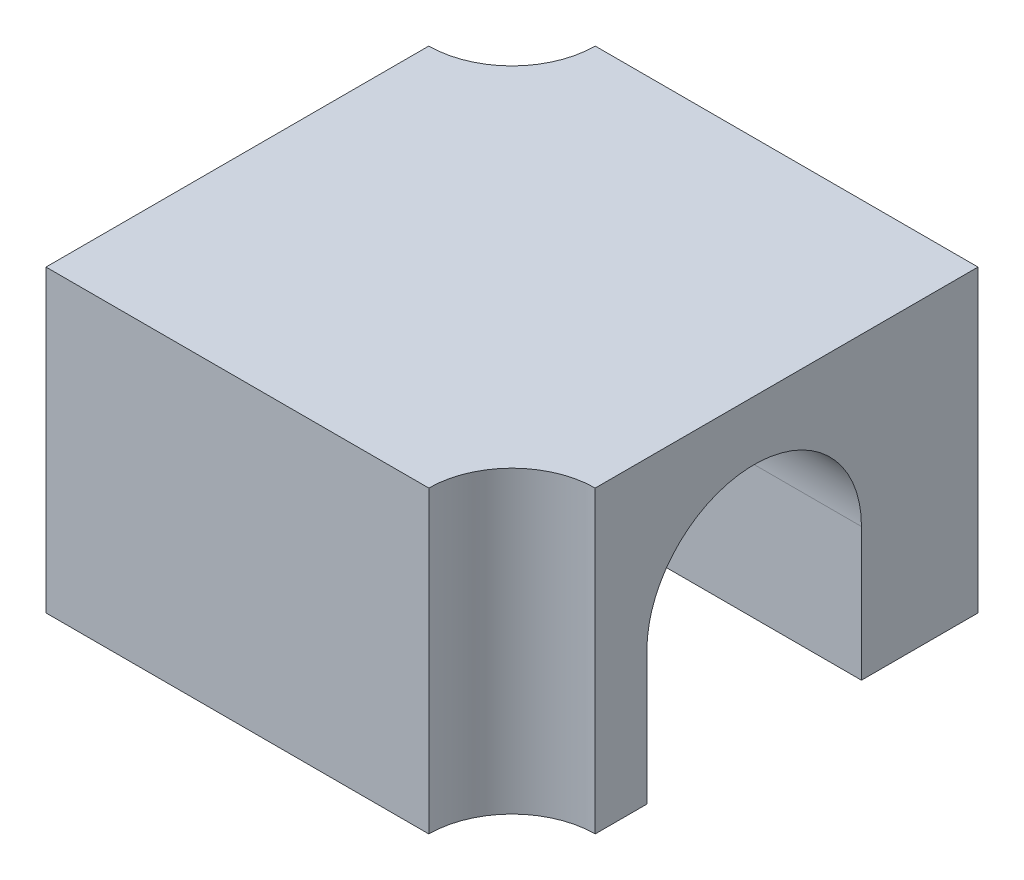
ISO-10303-21;
HEADER;
FILE_DESCRIPTION(('STEP AP214'),'2;1');
FILE_NAME('part.step','',(''),(''),'','','');
FILE_SCHEMA(('AUTOMOTIVE_DESIGN { 1 0 10303 214 1 1 1 1 }'));
ENDSEC;
DATA;
#1=APPLICATION_CONTEXT('core data for automotive mechanical design processes');
#2=APPLICATION_PROTOCOL_DEFINITION('international standard','automotive_design',2000,#1);
#3=PRODUCT_CONTEXT('',#1,'mechanical');
#4=PRODUCT('Part','Part','',(#3));
#5=PRODUCT_RELATED_PRODUCT_CATEGORY('part','',(#4));
#6=PRODUCT_DEFINITION_FORMATION('','',#4);
#7=PRODUCT_DEFINITION_CONTEXT('part definition',#1,'design');
#8=PRODUCT_DEFINITION('design','',#6,#7);
#9=PRODUCT_DEFINITION_SHAPE('','',#8);
#10=(LENGTH_UNIT() NAMED_UNIT(*) SI_UNIT(.MILLI.,.METRE.));
#11=(NAMED_UNIT(*) PLANE_ANGLE_UNIT() SI_UNIT($,.RADIAN.));
#12=(NAMED_UNIT(*) SI_UNIT($,.STERADIAN.) SOLID_ANGLE_UNIT());
#13=UNCERTAINTY_MEASURE_WITH_UNIT(LENGTH_MEASURE(1.E-05),#10,'distance_accuracy_value','');
#14=(GEOMETRIC_REPRESENTATION_CONTEXT(3) GLOBAL_UNCERTAINTY_ASSIGNED_CONTEXT((#13)) GLOBAL_UNIT_ASSIGNED_CONTEXT((#10,
#11,#12)) REPRESENTATION_CONTEXT('',''));
#15=CARTESIAN_POINT('',(0.,0.,0.));
#16=DIRECTION('',(0.,0.,1.));
#17=DIRECTION('',(1.,0.,0.));
#18=AXIS2_PLACEMENT_3D('',#15,#16,#17);
#19=CARTESIAN_POINT('',(64.1195583366425,36.,34.8141561904072));
#20=DIRECTION('',(-1.,0.,0.));
#21=DIRECTION('',(0.,0.,1.));
#22=AXIS2_PLACEMENT_3D('',#19,#20,#21);
#23=PLANE('',#22);
#24=DIRECTION('',(0.,0.,-1.));
#25=VECTOR('',#24,1.);
#26=CARTESIAN_POINT('',(64.1195583366425,36.,34.8141561904072));
#27=LINE('',#26,#25);
#28=CARTESIAN_POINT('',(64.1195583366425,36.,24.8141561904072));
#29=VERTEX_POINT('',#28);
#30=CARTESIAN_POINT('',(64.1195583366425,36.,-21.1858438095928));
#31=VERTEX_POINT('',#30);
#32=EDGE_CURVE('E130',#29,#31,#27,.T.);
#33=ORIENTED_EDGE('',*,*,#32,.F.);
#34=DIRECTION('',(0.,1.,0.));
#35=VECTOR('',#34,1.);
#36=CARTESIAN_POINT('',(64.1195583366425,-20.,24.8141561904072));
#37=LINE('',#36,#35);
#38=CARTESIAN_POINT('',(64.1195583366425,0.,24.8141561904072));
#39=VERTEX_POINT('',#38);
#40=EDGE_CURVE('E166',#39,#29,#37,.T.);
#41=ORIENTED_EDGE('',*,*,#40,.F.);
#42=DIRECTION('',(0.,0.,-1.));
#43=VECTOR('',#42,1.);
#44=CARTESIAN_POINT('',(64.1195583366425,0.,34.8141561904072));
#45=LINE('',#44,#43);
#46=CARTESIAN_POINT('',(64.1195583366425,0.,18.6064679655254));
#47=VERTEX_POINT('',#46);
#48=EDGE_CURVE('E142',#39,#47,#45,.T.);
#49=ORIENTED_EDGE('',*,*,#48,.T.);
#50=DIRECTION('',(0.,-1.,0.));
#51=VECTOR('',#50,1.);
#52=CARTESIAN_POINT('',(64.1195583366425,0.,18.6064679655254));
#53=LINE('',#52,#51);
#54=CARTESIAN_POINT('',(64.1195583366425,16.,18.6064679655254));
#55=VERTEX_POINT('',#54);
#56=EDGE_CURVE('E185',#55,#47,#53,.T.);
#57=ORIENTED_EDGE('',*,*,#56,.F.);
#58=CARTESIAN_POINT('',(64.1195583366425,16.,5.71266697348767));
#59=DIRECTION('',(1.,0.,0.));
#60=DIRECTION('',(0.,0.,-1.));
#61=AXIS2_PLACEMENT_3D('',#58,#59,#60);
#62=CIRCLE('',#61,12.8938009920377);
#63=CARTESIAN_POINT('',(64.1195583366425,16.,-7.18113401855002));
#64=VERTEX_POINT('',#63);
#65=EDGE_CURVE('E171',#64,#55,#62,.T.);
#66=ORIENTED_EDGE('',*,*,#65,.F.);
#67=DIRECTION('',(0.,-1.,0.));
#68=VECTOR('',#67,1.);
#69=CARTESIAN_POINT('',(64.1195583366425,0.,-7.18113401855003));
#70=LINE('',#69,#68);
#71=CARTESIAN_POINT('',(64.1195583366425,0.,-7.18113401855003));
#72=VERTEX_POINT('',#71);
#73=EDGE_CURVE('E158',#64,#72,#70,.T.);
#74=ORIENTED_EDGE('',*,*,#73,.T.);
#75=CARTESIAN_POINT('',(64.1195583366425,0.,-21.1858438095928));
#76=VERTEX_POINT('',#75);
#77=EDGE_CURVE('E144',#72,#76,#45,.T.);
#78=ORIENTED_EDGE('',*,*,#77,.T.);
#79=DIRECTION('',(0.,-1.,0.));
#80=VECTOR('',#79,1.);
#81=CARTESIAN_POINT('',(64.1195583366425,36.,-21.1858438095928));
#82=LINE('',#81,#80);
#83=EDGE_CURVE('E42',#31,#76,#82,.T.);
#84=ORIENTED_EDGE('',*,*,#83,.F.);
#85=EDGE_LOOP('',(#33,#41,#49,#57,#66,#74,#78,#84));
#86=FACE_BOUND('',#85,.T.);
#87=ADVANCED_FACE('F35',(#86),#23,.F.);
#88=CARTESIAN_POINT('',(8.11955833664251,36.,34.8141561904072));
#89=DIRECTION('',(1.,0.,0.));
#90=DIRECTION('',(0.,0.,-1.));
#91=AXIS2_PLACEMENT_3D('',#88,#89,#90);
#92=PLANE('',#91);
#93=DIRECTION('',(0.,0.,1.));
#94=VECTOR('',#93,1.);
#95=CARTESIAN_POINT('',(8.11955833664251,36.,34.8141561904072));
#96=LINE('',#95,#94);
#97=CARTESIAN_POINT('',(8.11955833664251,36.,-11.1858438095928));
#98=VERTEX_POINT('',#97);
#99=CARTESIAN_POINT('',(8.11955833664251,36.,34.8141561904072));
#100=VERTEX_POINT('',#99);
#101=EDGE_CURVE('E131',#98,#100,#96,.T.);
#102=ORIENTED_EDGE('',*,*,#101,.F.);
#103=DIRECTION('',(0.,1.,0.));
#104=VECTOR('',#103,1.);
#105=CARTESIAN_POINT('',(8.11955833664251,-20.,-11.1858438095928));
#106=LINE('',#105,#104);
#107=CARTESIAN_POINT('',(8.11955833664251,0.,-11.1858438095928));
#108=VERTEX_POINT('',#107);
#109=EDGE_CURVE('E49',#108,#98,#106,.T.);
#110=ORIENTED_EDGE('',*,*,#109,.F.);
#111=DIRECTION('',(0.,0.,1.));
#112=VECTOR('',#111,1.);
#113=CARTESIAN_POINT('',(8.11955833664251,0.,34.8141561904072));
#114=LINE('',#113,#112);
#115=CARTESIAN_POINT('',(8.11955833664251,0.,-7.18113401855003));
#116=VERTEX_POINT('',#115);
#117=EDGE_CURVE('E147',#108,#116,#114,.T.);
#118=ORIENTED_EDGE('',*,*,#117,.T.);
#119=DIRECTION('',(0.,-1.,0.));
#120=VECTOR('',#119,1.);
#121=CARTESIAN_POINT('',(8.11955833664251,0.,-7.18113401855003));
#122=LINE('',#121,#120);
#123=CARTESIAN_POINT('',(8.11955833664251,16.,-7.18113401855002));
#124=VERTEX_POINT('',#123);
#125=EDGE_CURVE('E179',#124,#116,#122,.T.);
#126=ORIENTED_EDGE('',*,*,#125,.F.);
#127=CARTESIAN_POINT('',(8.11955833664251,16.,5.71266697348767));
#128=DIRECTION('',(1.,0.,0.));
#129=DIRECTION('',(0.,0.,-1.));
#130=AXIS2_PLACEMENT_3D('',#127,#128,#129);
#131=CIRCLE('',#130,12.8938009920377);
#132=CARTESIAN_POINT('',(8.11955833664251,16.,18.6064679655254));
#133=VERTEX_POINT('',#132);
#134=EDGE_CURVE('E173',#124,#133,#131,.T.);
#135=ORIENTED_EDGE('',*,*,#134,.T.);
#136=DIRECTION('',(0.,-1.,0.));
#137=VECTOR('',#136,1.);
#138=CARTESIAN_POINT('',(8.11955833664251,0.,18.6064679655254));
#139=LINE('',#138,#137);
#140=CARTESIAN_POINT('',(8.11955833664251,0.,18.6064679655254));
#141=VERTEX_POINT('',#140);
#142=EDGE_CURVE('E176',#133,#141,#139,.T.);
#143=ORIENTED_EDGE('',*,*,#142,.T.);
#144=CARTESIAN_POINT('',(8.11955833664251,0.,34.8141561904072));
#145=VERTEX_POINT('',#144);
#146=EDGE_CURVE('E146',#141,#145,#114,.T.);
#147=ORIENTED_EDGE('',*,*,#146,.T.);
#148=DIRECTION('',(0.,-1.,0.));
#149=VECTOR('',#148,1.);
#150=CARTESIAN_POINT('',(8.11955833664251,36.,34.8141561904072));
#151=LINE('',#150,#149);
#152=EDGE_CURVE('E141',#100,#145,#151,.T.);
#153=ORIENTED_EDGE('',*,*,#152,.F.);
#154=EDGE_LOOP('',(#102,#110,#118,#126,#135,#143,#147,#153));
#155=FACE_BOUND('',#154,.T.);
#156=ADVANCED_FACE('F207',(#155),#92,.F.);
#157=CARTESIAN_POINT('',(0.,0.,0.));
#158=DIRECTION('',(0.,1.,0.));
#159=DIRECTION('',(0.,0.,1.));
#160=AXIS2_PLACEMENT_3D('',#157,#158,#159);
#161=PLANE('',#160);
#162=ORIENTED_EDGE('',*,*,#117,.F.);
#163=CARTESIAN_POINT('',(8.11955833664251,0.,-21.1858438095928));
#164=DIRECTION('',(0.,1.,0.));
#165=DIRECTION('',(0.,0.,1.));
#166=AXIS2_PLACEMENT_3D('',#163,#164,#165);
#167=CIRCLE('',#166,10.);
#168=CARTESIAN_POINT('',(18.1195583366425,0.,-21.1858438095928));
#169=VERTEX_POINT('',#168);
#170=EDGE_CURVE('E125',#108,#169,#167,.T.);
#171=ORIENTED_EDGE('',*,*,#170,.T.);
#172=DIRECTION('',(-1.,0.,0.));
#173=VECTOR('',#172,1.);
#174=CARTESIAN_POINT('',(64.1195583366425,0.,-21.1858438095928));
#175=LINE('',#174,#173);
#176=EDGE_CURVE('E124',#76,#169,#175,.T.);
#177=ORIENTED_EDGE('',*,*,#176,.F.);
#178=ORIENTED_EDGE('',*,*,#77,.F.);
#179=DIRECTION('',(1.,0.,0.));
#180=VECTOR('',#179,1.);
#181=CARTESIAN_POINT('',(8.11955833664251,0.,-7.18113401855003));
#182=LINE('',#181,#180);
#183=EDGE_CURVE('E190',#116,#72,#182,.T.);
#184=ORIENTED_EDGE('',*,*,#183,.F.);
#185=EDGE_LOOP('',(#162,#171,#177,#178,#184));
#186=FACE_BOUND('',#185,.T.);
#187=ADVANCED_FACE('F163',(#186),#161,.F.);
#188=CARTESIAN_POINT('',(64.1195583366425,36.,-21.1858438095928));
#189=DIRECTION('',(0.,0.,1.));
#190=DIRECTION('',(1.,0.,0.));
#191=AXIS2_PLACEMENT_3D('',#188,#189,#190);
#192=PLANE('',#191);
#193=ORIENTED_EDGE('',*,*,#176,.T.);
#194=DIRECTION('',(0.,1.,0.));
#195=VECTOR('',#194,1.);
#196=CARTESIAN_POINT('',(18.1195583366425,-20.,-21.1858438095928));
#197=LINE('',#196,#195);
#198=CARTESIAN_POINT('',(18.1195583366425,36.,-21.1858438095928));
#199=VERTEX_POINT('',#198);
#200=EDGE_CURVE('E110',#169,#199,#197,.T.);
#201=ORIENTED_EDGE('',*,*,#200,.T.);
#202=DIRECTION('',(-1.,0.,0.));
#203=VECTOR('',#202,1.);
#204=CARTESIAN_POINT('',(64.1195583366425,36.,-21.1858438095928));
#205=LINE('',#204,#203);
#206=EDGE_CURVE('E121',#31,#199,#205,.T.);
#207=ORIENTED_EDGE('',*,*,#206,.F.);
#208=ORIENTED_EDGE('',*,*,#83,.T.);
#209=EDGE_LOOP('',(#193,#201,#207,#208));
#210=FACE_BOUND('',#209,.T.);
#211=ADVANCED_FACE('F119',(#210),#192,.F.);
#212=CARTESIAN_POINT('',(64.1195583366425,36.,34.8141561904072));
#213=DIRECTION('',(0.,0.,-1.));
#214=DIRECTION('',(-1.,0.,0.));
#215=AXIS2_PLACEMENT_3D('',#212,#213,#214);
#216=PLANE('',#215);
#217=DIRECTION('',(1.,0.,0.));
#218=VECTOR('',#217,1.);
#219=CARTESIAN_POINT('',(64.1195583366425,0.,34.8141561904072));
#220=LINE('',#219,#218);
#221=CARTESIAN_POINT('',(54.1195583366425,0.,34.8141561904072));
#222=VERTEX_POINT('',#221);
#223=EDGE_CURVE('E135',#145,#222,#220,.T.);
#224=ORIENTED_EDGE('',*,*,#223,.T.);
#225=DIRECTION('',(0.,1.,0.));
#226=VECTOR('',#225,1.);
#227=CARTESIAN_POINT('',(54.1195583366425,-20.,34.8141561904072));
#228=LINE('',#227,#226);
#229=CARTESIAN_POINT('',(54.1195583366425,36.,34.8141561904072));
#230=VERTEX_POINT('',#229);
#231=EDGE_CURVE('E57',#222,#230,#228,.T.);
#232=ORIENTED_EDGE('',*,*,#231,.T.);
#233=DIRECTION('',(1.,0.,0.));
#234=VECTOR('',#233,1.);
#235=CARTESIAN_POINT('',(64.1195583366425,36.,34.8141561904072));
#236=LINE('',#235,#234);
#237=EDGE_CURVE('E133',#100,#230,#236,.T.);
#238=ORIENTED_EDGE('',*,*,#237,.F.);
#239=ORIENTED_EDGE('',*,*,#152,.T.);
#240=EDGE_LOOP('',(#224,#232,#238,#239));
#241=FACE_BOUND('',#240,.T.);
#242=ADVANCED_FACE('F232',(#241),#216,.F.);
#243=CARTESIAN_POINT('',(0.,36.,0.));
#244=DIRECTION('',(0.,1.,0.));
#245=DIRECTION('',(0.,0.,1.));
#246=AXIS2_PLACEMENT_3D('',#243,#244,#245);
#247=PLANE('',#246);
#248=CARTESIAN_POINT('',(8.11955833664251,36.,-21.1858438095928));
#249=DIRECTION('',(0.,1.,0.));
#250=DIRECTION('',(0.,0.,1.));
#251=AXIS2_PLACEMENT_3D('',#248,#249,#250);
#252=CIRCLE('',#251,10.);
#253=EDGE_CURVE('E107',#98,#199,#252,.T.);
#254=ORIENTED_EDGE('',*,*,#253,.F.);
#255=ORIENTED_EDGE('',*,*,#101,.T.);
#256=ORIENTED_EDGE('',*,*,#237,.T.);
#257=CARTESIAN_POINT('',(64.1195583366425,36.,34.8141561904072));
#258=DIRECTION('',(0.,1.,0.));
#259=DIRECTION('',(0.,0.,1.));
#260=AXIS2_PLACEMENT_3D('',#257,#258,#259);
#261=CIRCLE('',#260,9.99999999999999);
#262=EDGE_CURVE('E164',#29,#230,#261,.T.);
#263=ORIENTED_EDGE('',*,*,#262,.F.);
#264=ORIENTED_EDGE('',*,*,#32,.T.);
#265=ORIENTED_EDGE('',*,*,#206,.T.);
#266=EDGE_LOOP('',(#254,#255,#256,#263,#264,#265));
#267=FACE_BOUND('',#266,.T.);
#268=ADVANCED_FACE('F127',(#267),#247,.T.);
#269=ORIENTED_EDGE('',*,*,#48,.F.);
#270=CARTESIAN_POINT('',(64.1195583366425,0.,34.8141561904072));
#271=DIRECTION('',(0.,1.,0.));
#272=DIRECTION('',(0.,0.,1.));
#273=AXIS2_PLACEMENT_3D('',#270,#271,#272);
#274=CIRCLE('',#273,9.99999999999999);
#275=EDGE_CURVE('E11',#39,#222,#274,.T.);
#276=ORIENTED_EDGE('',*,*,#275,.T.);
#277=ORIENTED_EDGE('',*,*,#223,.F.);
#278=ORIENTED_EDGE('',*,*,#146,.F.);
#279=DIRECTION('',(1.,0.,0.));
#280=VECTOR('',#279,1.);
#281=CARTESIAN_POINT('',(8.11955833664251,0.,18.6064679655254));
#282=LINE('',#281,#280);
#283=EDGE_CURVE('E192',#141,#47,#282,.T.);
#284=ORIENTED_EDGE('',*,*,#283,.T.);
#285=EDGE_LOOP('',(#269,#276,#277,#278,#284));
#286=FACE_BOUND('',#285,.T.);
#287=ADVANCED_FACE('F203',(#286),#161,.F.);
#288=CARTESIAN_POINT('',(8.11955833664251,16.,5.71266697348767));
#289=DIRECTION('',(1.,0.,0.));
#290=DIRECTION('',(0.,0.,-1.));
#291=AXIS2_PLACEMENT_3D('',#288,#289,#290);
#292=CYLINDRICAL_SURFACE('',#291,12.8938009920377);
#293=ORIENTED_EDGE('',*,*,#65,.T.);
#294=DIRECTION('',(1.,0.,0.));
#295=VECTOR('',#294,1.);
#296=CARTESIAN_POINT('',(8.11955833664251,16.,18.6064679655254));
#297=LINE('',#296,#295);
#298=EDGE_CURVE('E182',#133,#55,#297,.T.);
#299=ORIENTED_EDGE('',*,*,#298,.F.);
#300=ORIENTED_EDGE('',*,*,#134,.F.);
#301=DIRECTION('',(1.,0.,0.));
#302=VECTOR('',#301,1.);
#303=CARTESIAN_POINT('',(8.11955833664251,16.,-7.18113401855002));
#304=LINE('',#303,#302);
#305=EDGE_CURVE('E161',#124,#64,#304,.T.);
#306=ORIENTED_EDGE('',*,*,#305,.T.);
#307=EDGE_LOOP('',(#293,#299,#300,#306));
#308=FACE_BOUND('',#307,.T.);
#309=ADVANCED_FACE('F200',(#308),#292,.F.);
#310=CARTESIAN_POINT('',(8.11955833664251,0.,-7.18113401855003));
#311=DIRECTION('',(0.,0.,1.));
#312=DIRECTION('',(0.,-1.,0.));
#313=AXIS2_PLACEMENT_3D('',#310,#311,#312);
#314=PLANE('',#313);
#315=ORIENTED_EDGE('',*,*,#73,.F.);
#316=ORIENTED_EDGE('',*,*,#305,.F.);
#317=ORIENTED_EDGE('',*,*,#125,.T.);
#318=ORIENTED_EDGE('',*,*,#183,.T.);
#319=EDGE_LOOP('',(#315,#316,#317,#318));
#320=FACE_BOUND('',#319,.T.);
#321=ADVANCED_FACE('F211',(#320),#314,.T.);
#322=CARTESIAN_POINT('',(8.11955833664251,0.,18.6064679655254));
#323=DIRECTION('',(0.,0.,1.));
#324=DIRECTION('',(1.,0.,0.));
#325=AXIS2_PLACEMENT_3D('',#322,#323,#324);
#326=PLANE('',#325);
#327=ORIENTED_EDGE('',*,*,#56,.T.);
#328=ORIENTED_EDGE('',*,*,#283,.F.);
#329=ORIENTED_EDGE('',*,*,#142,.F.);
#330=ORIENTED_EDGE('',*,*,#298,.T.);
#331=EDGE_LOOP('',(#327,#328,#329,#330));
#332=FACE_BOUND('',#331,.T.);
#333=ADVANCED_FACE('F196',(#332),#326,.F.);
#334=CARTESIAN_POINT('',(64.1195583366425,-20.,34.8141561904072));
#335=DIRECTION('',(0.,1.,0.));
#336=DIRECTION('',(0.,0.,1.));
#337=AXIS2_PLACEMENT_3D('',#334,#335,#336);
#338=CYLINDRICAL_SURFACE('',#337,9.99999999999999);
#339=ORIENTED_EDGE('',*,*,#40,.T.);
#340=ORIENTED_EDGE('',*,*,#262,.T.);
#341=ORIENTED_EDGE('',*,*,#231,.F.);
#342=ORIENTED_EDGE('',*,*,#275,.F.);
#343=EDGE_LOOP('',(#339,#340,#341,#342));
#344=FACE_BOUND('',#343,.T.);
#345=ADVANCED_FACE('F218',(#344),#338,.F.);
#346=CARTESIAN_POINT('',(8.11955833664251,-20.,-21.1858438095928));
#347=DIRECTION('',(0.,1.,0.));
#348=DIRECTION('',(0.,0.,1.));
#349=AXIS2_PLACEMENT_3D('',#346,#347,#348);
#350=CYLINDRICAL_SURFACE('',#349,10.);
#351=ORIENTED_EDGE('',*,*,#109,.T.);
#352=ORIENTED_EDGE('',*,*,#253,.T.);
#353=ORIENTED_EDGE('',*,*,#200,.F.);
#354=ORIENTED_EDGE('',*,*,#170,.F.);
#355=EDGE_LOOP('',(#351,#352,#353,#354));
#356=FACE_BOUND('',#355,.T.);
#357=ADVANCED_FACE('F109',(#356),#350,.F.);
#358=CLOSED_SHELL('',(#87,#156,#187,#211,#242,#268,#287,#309,#321,#333,#345,#357));
#359=MANIFOLD_SOLID_BREP('B2',#358);
#360=ADVANCED_BREP_SHAPE_REPRESENTATION('',(#18,#359),#14);
#361=SHAPE_DEFINITION_REPRESENTATION(#9,#360);
ENDSEC;
END-ISO-10303-21;
